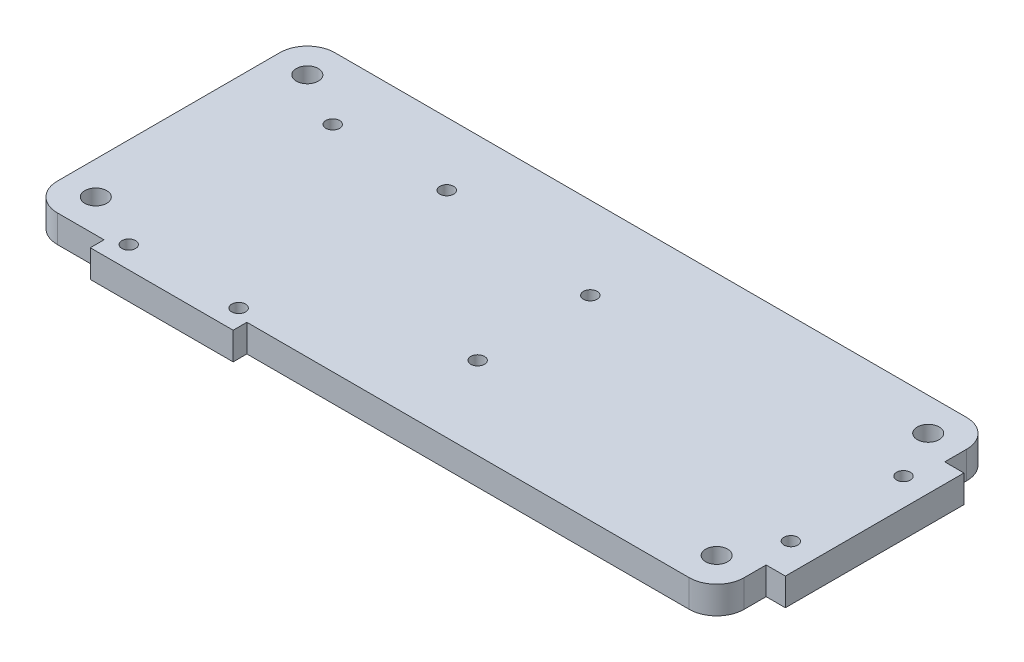
ISO-10303-21;
HEADER;
FILE_DESCRIPTION(('STEP AP214'),'2;1');
FILE_NAME('part.step','',(''),(''),'','','');
FILE_SCHEMA(('AUTOMOTIVE_DESIGN { 1 0 10303 214 1 1 1 1 }'));
ENDSEC;
DATA;
#1=APPLICATION_CONTEXT('core data for automotive mechanical design processes');
#2=APPLICATION_PROTOCOL_DEFINITION('international standard','automotive_design',2000,#1);
#3=PRODUCT_CONTEXT('',#1,'mechanical');
#4=PRODUCT('Part','Part','',(#3));
#5=PRODUCT_RELATED_PRODUCT_CATEGORY('part','',(#4));
#6=PRODUCT_DEFINITION_FORMATION('','',#4);
#7=PRODUCT_DEFINITION_CONTEXT('part definition',#1,'design');
#8=PRODUCT_DEFINITION('design','',#6,#7);
#9=PRODUCT_DEFINITION_SHAPE('','',#8);
#10=(LENGTH_UNIT() NAMED_UNIT(*) SI_UNIT(.MILLI.,.METRE.));
#11=(NAMED_UNIT(*) PLANE_ANGLE_UNIT() SI_UNIT($,.RADIAN.));
#12=(NAMED_UNIT(*) SI_UNIT($,.STERADIAN.) SOLID_ANGLE_UNIT());
#13=UNCERTAINTY_MEASURE_WITH_UNIT(LENGTH_MEASURE(1.E-05),#10,'distance_accuracy_value','');
#14=(GEOMETRIC_REPRESENTATION_CONTEXT(3) GLOBAL_UNCERTAINTY_ASSIGNED_CONTEXT((#13)) GLOBAL_UNIT_ASSIGNED_CONTEXT((#10,
#11,#12)) REPRESENTATION_CONTEXT('',''));
#15=CARTESIAN_POINT('',(0.,0.,0.));
#16=DIRECTION('',(0.,0.,1.));
#17=DIRECTION('',(1.,0.,0.));
#18=AXIS2_PLACEMENT_3D('',#15,#16,#17);
#19=CARTESIAN_POINT('',(0.,5.,0.));
#20=DIRECTION('',(0.,1.,0.));
#21=DIRECTION('',(0.,0.,1.));
#22=AXIS2_PLACEMENT_3D('',#19,#20,#21);
#23=PLANE('',#22);
#24=CARTESIAN_POINT('',(119.,5.,-44.5));
#25=DIRECTION('',(0.,1.,0.));
#26=DIRECTION('',(0.,0.,1.));
#27=AXIS2_PLACEMENT_3D('',#24,#25,#26);
#28=CIRCLE('',#27,2.);
#29=CARTESIAN_POINT('',(119.,5.,-42.5));
#30=VERTEX_POINT('',#29);
#31=EDGE_CURVE('E240',#30,#30,#28,.T.);
#32=ORIENTED_EDGE('',*,*,#31,.F.);
#33=EDGE_LOOP('',(#32));
#34=FACE_BOUND('',#33,.T.);
#35=CARTESIAN_POINT('',(6.,5.,-44.5));
#36=DIRECTION('',(0.,1.,0.));
#37=DIRECTION('',(0.,0.,1.));
#38=AXIS2_PLACEMENT_3D('',#35,#36,#37);
#39=CIRCLE('',#38,2.);
#40=CARTESIAN_POINT('',(6.,5.,-42.5));
#41=VERTEX_POINT('',#40);
#42=EDGE_CURVE('E244',#41,#41,#39,.T.);
#43=ORIENTED_EDGE('',*,*,#42,.F.);
#44=EDGE_LOOP('',(#43));
#45=FACE_BOUND('',#44,.T.);
#46=CARTESIAN_POINT('',(6.,5.,-6.));
#47=DIRECTION('',(0.,1.,0.));
#48=DIRECTION('',(0.,0.,1.));
#49=AXIS2_PLACEMENT_3D('',#46,#47,#48);
#50=CIRCLE('',#49,2.);
#51=CARTESIAN_POINT('',(6.,5.,-4.));
#52=VERTEX_POINT('',#51);
#53=EDGE_CURVE('E249',#52,#52,#50,.T.);
#54=ORIENTED_EDGE('',*,*,#53,.F.);
#55=EDGE_LOOP('',(#54));
#56=FACE_BOUND('',#55,.T.);
#57=CARTESIAN_POINT('',(119.,5.,-6.));
#58=DIRECTION('',(0.,1.,0.));
#59=DIRECTION('',(0.,0.,1.));
#60=AXIS2_PLACEMENT_3D('',#57,#58,#59);
#61=CIRCLE('',#60,2.);
#62=CARTESIAN_POINT('',(119.,5.,-4.));
#63=VERTEX_POINT('',#62);
#64=EDGE_CURVE('E253',#63,#63,#61,.T.);
#65=ORIENTED_EDGE('',*,*,#64,.F.);
#66=EDGE_LOOP('',(#65));
#67=FACE_BOUND('',#66,.T.);
#68=CARTESIAN_POINT('',(123.5,5.,-15.));
#69=DIRECTION('',(0.,1.,0.));
#70=DIRECTION('',(0.,0.,1.));
#71=AXIS2_PLACEMENT_3D('',#68,#69,#70);
#72=CIRCLE('',#71,1.25);
#73=CARTESIAN_POINT('',(123.5,5.,-13.75));
#74=VERTEX_POINT('',#73);
#75=EDGE_CURVE('E257',#74,#74,#72,.T.);
#76=ORIENTED_EDGE('',*,*,#75,.F.);
#77=EDGE_LOOP('',(#76));
#78=FACE_BOUND('',#77,.T.);
#79=CARTESIAN_POINT('',(66.5,5.,-15.));
#80=DIRECTION('',(0.,1.,0.));
#81=DIRECTION('',(0.,0.,1.));
#82=AXIS2_PLACEMENT_3D('',#79,#80,#81);
#83=CIRCLE('',#82,1.25);
#84=CARTESIAN_POINT('',(66.5,5.,-13.75));
#85=VERTEX_POINT('',#84);
#86=EDGE_CURVE('E261',#85,#85,#83,.T.);
#87=ORIENTED_EDGE('',*,*,#86,.F.);
#88=EDGE_LOOP('',(#87));
#89=FACE_BOUND('',#88,.T.);
#90=CARTESIAN_POINT('',(123.5,5.,-35.5));
#91=DIRECTION('',(0.,1.,0.));
#92=DIRECTION('',(0.,0.,1.));
#93=AXIS2_PLACEMENT_3D('',#90,#91,#92);
#94=CIRCLE('',#93,1.24999999999997);
#95=CARTESIAN_POINT('',(123.5,5.,-34.25));
#96=VERTEX_POINT('',#95);
#97=EDGE_CURVE('E265',#96,#96,#94,.T.);
#98=ORIENTED_EDGE('',*,*,#97,.F.);
#99=EDGE_LOOP('',(#98));
#100=FACE_BOUND('',#99,.T.);
#101=CARTESIAN_POINT('',(36.875,5.,-39.));
#102=DIRECTION('',(0.,1.,0.));
#103=DIRECTION('',(0.,0.,1.));
#104=AXIS2_PLACEMENT_3D('',#101,#102,#103);
#105=CIRCLE('',#104,1.25);
#106=CARTESIAN_POINT('',(36.875,5.,-37.75));
#107=VERTEX_POINT('',#106);
#108=EDGE_CURVE('E269',#107,#107,#105,.T.);
#109=ORIENTED_EDGE('',*,*,#108,.F.);
#110=EDGE_LOOP('',(#109));
#111=FACE_BOUND('',#110,.T.);
#112=CARTESIAN_POINT('',(36.5,5.,-1.5));
#113=DIRECTION('',(0.,1.,0.));
#114=DIRECTION('',(0.,0.,1.));
#115=AXIS2_PLACEMENT_3D('',#112,#113,#114);
#116=CIRCLE('',#115,1.25);
#117=CARTESIAN_POINT('',(36.5,5.,-0.250000000000002));
#118=VERTEX_POINT('',#117);
#119=EDGE_CURVE('E273',#118,#118,#116,.T.);
#120=ORIENTED_EDGE('',*,*,#119,.F.);
#121=EDGE_LOOP('',(#120));
#122=FACE_BOUND('',#121,.T.);
#123=CARTESIAN_POINT('',(16.5,5.,-1.5));
#124=DIRECTION('',(0.,1.,0.));
#125=DIRECTION('',(0.,0.,1.));
#126=AXIS2_PLACEMENT_3D('',#123,#124,#125);
#127=CIRCLE('',#126,1.25);
#128=CARTESIAN_POINT('',(16.5,5.,-0.249999999999999));
#129=VERTEX_POINT('',#128);
#130=EDGE_CURVE('E277',#129,#129,#127,.T.);
#131=ORIENTED_EDGE('',*,*,#130,.F.);
#132=EDGE_LOOP('',(#131));
#133=FACE_BOUND('',#132,.T.);
#134=CARTESIAN_POINT('',(16.125,5.,-39.));
#135=DIRECTION('',(0.,1.,0.));
#136=DIRECTION('',(0.,0.,1.));
#137=AXIS2_PLACEMENT_3D('',#134,#135,#136);
#138=CIRCLE('',#137,1.25);
#139=CARTESIAN_POINT('',(16.125,5.,-37.75));
#140=VERTEX_POINT('',#139);
#141=EDGE_CURVE('E299',#140,#140,#138,.T.);
#142=ORIENTED_EDGE('',*,*,#141,.F.);
#143=EDGE_LOOP('',(#142));
#144=FACE_BOUND('',#143,.T.);
#145=CARTESIAN_POINT('',(66.5,5.,-35.5));
#146=DIRECTION('',(0.,1.,0.));
#147=DIRECTION('',(0.,0.,1.));
#148=AXIS2_PLACEMENT_3D('',#145,#146,#147);
#149=CIRCLE('',#148,1.24999999999997);
#150=CARTESIAN_POINT('',(66.5,5.,-34.25));
#151=VERTEX_POINT('',#150);
#152=EDGE_CURVE('E303',#151,#151,#149,.T.);
#153=ORIENTED_EDGE('',*,*,#152,.F.);
#154=EDGE_LOOP('',(#153));
#155=FACE_BOUND('',#154,.T.);
#156=DIRECTION('',(0.,0.,1.));
#157=VECTOR('',#156,1.);
#158=CARTESIAN_POINT('',(13.5,5.,0.));
#159=LINE('',#158,#157);
#160=CARTESIAN_POINT('',(13.5,5.,0.));
#161=VERTEX_POINT('',#160);
#162=CARTESIAN_POINT('',(13.5,5.,2.5));
#163=VERTEX_POINT('',#162);
#164=EDGE_CURVE('E205',#161,#163,#159,.T.);
#165=ORIENTED_EDGE('',*,*,#164,.T.);
#166=DIRECTION('',(-1.,0.,0.));
#167=VECTOR('',#166,1.);
#168=CARTESIAN_POINT('',(13.5,5.,2.5));
#169=LINE('',#168,#167);
#170=CARTESIAN_POINT('',(39.5,5.,2.5));
#171=VERTEX_POINT('',#170);
#172=EDGE_CURVE('E202',#171,#163,#169,.T.);
#173=ORIENTED_EDGE('',*,*,#172,.F.);
#174=DIRECTION('',(0.,0.,-1.));
#175=VECTOR('',#174,1.);
#176=CARTESIAN_POINT('',(39.5,5.,0.));
#177=LINE('',#176,#175);
#178=CARTESIAN_POINT('',(39.5,5.,0.));
#179=VERTEX_POINT('',#178);
#180=EDGE_CURVE('E68',#171,#179,#177,.T.);
#181=ORIENTED_EDGE('',*,*,#180,.T.);
#182=DIRECTION('',(1.,0.,0.));
#183=VECTOR('',#182,1.);
#184=CARTESIAN_POINT('',(0.,5.,0.));
#185=LINE('',#184,#183);
#186=CARTESIAN_POINT('',(120.,5.,0.));
#187=VERTEX_POINT('',#186);
#188=EDGE_CURVE('E294',#179,#187,#185,.T.);
#189=ORIENTED_EDGE('',*,*,#188,.T.);
#190=CARTESIAN_POINT('',(120.,5.,-5.));
#191=DIRECTION('',(0.,1.,0.));
#192=DIRECTION('',(0.,0.,1.));
#193=AXIS2_PLACEMENT_3D('',#190,#191,#192);
#194=CIRCLE('',#193,5.);
#195=CARTESIAN_POINT('',(125.,5.,-5.));
#196=VERTEX_POINT('',#195);
#197=EDGE_CURVE('E384',#187,#196,#194,.T.);
#198=ORIENTED_EDGE('',*,*,#197,.T.);
#199=DIRECTION('',(0.,0.,-1.));
#200=VECTOR('',#199,1.);
#201=CARTESIAN_POINT('',(125.,5.,0.));
#202=LINE('',#201,#200);
#203=CARTESIAN_POINT('',(125.,5.,-9.));
#204=VERTEX_POINT('',#203);
#205=EDGE_CURVE('E282',#196,#204,#202,.T.);
#206=ORIENTED_EDGE('',*,*,#205,.T.);
#207=DIRECTION('',(1.,0.,0.));
#208=VECTOR('',#207,1.);
#209=CARTESIAN_POINT('',(125.,5.,-9.));
#210=LINE('',#209,#208);
#211=CARTESIAN_POINT('',(128.5,5.,-9.));
#212=VERTEX_POINT('',#211);
#213=EDGE_CURVE('E222',#204,#212,#210,.T.);
#214=ORIENTED_EDGE('',*,*,#213,.T.);
#215=DIRECTION('',(0.,0.,1.));
#216=VECTOR('',#215,1.);
#217=CARTESIAN_POINT('',(128.5,5.,-9.));
#218=LINE('',#217,#216);
#219=CARTESIAN_POINT('',(128.5,5.,-41.5));
#220=VERTEX_POINT('',#219);
#221=EDGE_CURVE('E186',#220,#212,#218,.T.);
#222=ORIENTED_EDGE('',*,*,#221,.F.);
#223=DIRECTION('',(-1.,0.,0.));
#224=VECTOR('',#223,1.);
#225=CARTESIAN_POINT('',(128.,5.,-41.5));
#226=LINE('',#225,#224);
#227=CARTESIAN_POINT('',(125.,5.,-41.5));
#228=VERTEX_POINT('',#227);
#229=EDGE_CURVE('E171',#220,#228,#226,.T.);
#230=ORIENTED_EDGE('',*,*,#229,.T.);
#231=CARTESIAN_POINT('',(125.,5.,-45.5));
#232=VERTEX_POINT('',#231);
#233=EDGE_CURVE('E281',#228,#232,#202,.T.);
#234=ORIENTED_EDGE('',*,*,#233,.T.);
#235=CARTESIAN_POINT('',(120.,5.,-45.5));
#236=DIRECTION('',(0.,1.,0.));
#237=DIRECTION('',(0.,0.,1.));
#238=AXIS2_PLACEMENT_3D('',#235,#236,#237);
#239=CIRCLE('',#238,5.);
#240=CARTESIAN_POINT('',(120.,5.,-50.5));
#241=VERTEX_POINT('',#240);
#242=EDGE_CURVE('E387',#232,#241,#239,.T.);
#243=ORIENTED_EDGE('',*,*,#242,.T.);
#244=DIRECTION('',(1.,0.,0.));
#245=VECTOR('',#244,1.);
#246=CARTESIAN_POINT('',(0.,5.,-50.5));
#247=LINE('',#246,#245);
#248=CARTESIAN_POINT('',(5.,5.,-50.5));
#249=VERTEX_POINT('',#248);
#250=EDGE_CURVE('E286',#249,#241,#247,.T.);
#251=ORIENTED_EDGE('',*,*,#250,.F.);
#252=CARTESIAN_POINT('',(5.,5.,-45.5));
#253=DIRECTION('',(0.,1.,0.));
#254=DIRECTION('',(0.,0.,1.));
#255=AXIS2_PLACEMENT_3D('',#252,#253,#254);
#256=CIRCLE('',#255,5.);
#257=CARTESIAN_POINT('',(0.,5.,-45.5));
#258=VERTEX_POINT('',#257);
#259=EDGE_CURVE('E390',#249,#258,#256,.T.);
#260=ORIENTED_EDGE('',*,*,#259,.T.);
#261=DIRECTION('',(0.,0.,-1.));
#262=VECTOR('',#261,1.);
#263=CARTESIAN_POINT('',(0.,5.,0.));
#264=LINE('',#263,#262);
#265=CARTESIAN_POINT('',(0.,5.,-5.));
#266=VERTEX_POINT('',#265);
#267=EDGE_CURVE('E290',#266,#258,#264,.T.);
#268=ORIENTED_EDGE('',*,*,#267,.F.);
#269=CARTESIAN_POINT('',(5.,5.,-5.));
#270=DIRECTION('',(0.,1.,0.));
#271=DIRECTION('',(0.,0.,1.));
#272=AXIS2_PLACEMENT_3D('',#269,#270,#271);
#273=CIRCLE('',#272,5.);
#274=CARTESIAN_POINT('',(5.,5.,0.));
#275=VERTEX_POINT('',#274);
#276=EDGE_CURVE('E381',#266,#275,#273,.T.);
#277=ORIENTED_EDGE('',*,*,#276,.T.);
#278=EDGE_CURVE('E295',#275,#161,#185,.T.);
#279=ORIENTED_EDGE('',*,*,#278,.T.);
#280=EDGE_LOOP('',(#165,#173,#181,#189,#198,#206,#214,#222,#230,#234,#243,#251,#260,#268,#277,#279));
#281=FACE_BOUND('',#280,.T.);
#282=ADVANCED_FACE('F43',(#34,#45,#56,#67,#78,#89,#100,#111,#122,#133,#144,#155,#281),#23,.T.);
#283=CARTESIAN_POINT('',(0.,0.,0.));
#284=DIRECTION('',(0.,1.,0.));
#285=DIRECTION('',(0.,0.,1.));
#286=AXIS2_PLACEMENT_3D('',#283,#284,#285);
#287=PLANE('',#286);
#288=CARTESIAN_POINT('',(66.5,0.,-35.5));
#289=DIRECTION('',(0.,1.,0.));
#290=DIRECTION('',(0.,0.,1.));
#291=AXIS2_PLACEMENT_3D('',#288,#289,#290);
#292=CIRCLE('',#291,1.24999999999997);
#293=CARTESIAN_POINT('',(66.5,0.,-34.25));
#294=VERTEX_POINT('',#293);
#295=EDGE_CURVE('E245',#294,#294,#292,.T.);
#296=ORIENTED_EDGE('',*,*,#295,.T.);
#297=EDGE_LOOP('',(#296));
#298=FACE_BOUND('',#297,.T.);
#299=CARTESIAN_POINT('',(16.125,0.,-39.));
#300=DIRECTION('',(0.,1.,0.));
#301=DIRECTION('',(0.,0.,1.));
#302=AXIS2_PLACEMENT_3D('',#299,#300,#301);
#303=CIRCLE('',#302,1.25);
#304=CARTESIAN_POINT('',(16.125,0.,-37.75));
#305=VERTEX_POINT('',#304);
#306=EDGE_CURVE('E347',#305,#305,#303,.T.);
#307=ORIENTED_EDGE('',*,*,#306,.T.);
#308=EDGE_LOOP('',(#307));
#309=FACE_BOUND('',#308,.T.);
#310=CARTESIAN_POINT('',(16.5,0.,-1.5));
#311=DIRECTION('',(0.,1.,0.));
#312=DIRECTION('',(0.,0.,1.));
#313=AXIS2_PLACEMENT_3D('',#310,#311,#312);
#314=CIRCLE('',#313,1.25);
#315=CARTESIAN_POINT('',(16.5,0.,-0.249999999999999));
#316=VERTEX_POINT('',#315);
#317=EDGE_CURVE('E327',#316,#316,#314,.T.);
#318=ORIENTED_EDGE('',*,*,#317,.T.);
#319=EDGE_LOOP('',(#318));
#320=FACE_BOUND('',#319,.T.);
#321=CARTESIAN_POINT('',(36.5,0.,-1.5));
#322=DIRECTION('',(0.,1.,0.));
#323=DIRECTION('',(0.,0.,1.));
#324=AXIS2_PLACEMENT_3D('',#321,#322,#323);
#325=CIRCLE('',#324,1.25);
#326=CARTESIAN_POINT('',(36.5,0.,-0.250000000000002));
#327=VERTEX_POINT('',#326);
#328=EDGE_CURVE('E323',#327,#327,#325,.T.);
#329=ORIENTED_EDGE('',*,*,#328,.T.);
#330=EDGE_LOOP('',(#329));
#331=FACE_BOUND('',#330,.T.);
#332=CARTESIAN_POINT('',(36.875,0.,-39.));
#333=DIRECTION('',(0.,1.,0.));
#334=DIRECTION('',(0.,0.,1.));
#335=AXIS2_PLACEMENT_3D('',#332,#333,#334);
#336=CIRCLE('',#335,1.25);
#337=CARTESIAN_POINT('',(36.875,0.,-37.75));
#338=VERTEX_POINT('',#337);
#339=EDGE_CURVE('E319',#338,#338,#336,.T.);
#340=ORIENTED_EDGE('',*,*,#339,.T.);
#341=EDGE_LOOP('',(#340));
#342=FACE_BOUND('',#341,.T.);
#343=CARTESIAN_POINT('',(123.5,0.,-35.5));
#344=DIRECTION('',(0.,1.,0.));
#345=DIRECTION('',(0.,0.,1.));
#346=AXIS2_PLACEMENT_3D('',#343,#344,#345);
#347=CIRCLE('',#346,1.24999999999997);
#348=CARTESIAN_POINT('',(123.5,0.,-34.25));
#349=VERTEX_POINT('',#348);
#350=EDGE_CURVE('E315',#349,#349,#347,.T.);
#351=ORIENTED_EDGE('',*,*,#350,.T.);
#352=EDGE_LOOP('',(#351));
#353=FACE_BOUND('',#352,.T.);
#354=CARTESIAN_POINT('',(66.5,0.,-15.));
#355=DIRECTION('',(0.,1.,0.));
#356=DIRECTION('',(0.,0.,1.));
#357=AXIS2_PLACEMENT_3D('',#354,#355,#356);
#358=CIRCLE('',#357,1.25);
#359=CARTESIAN_POINT('',(66.5,0.,-13.75));
#360=VERTEX_POINT('',#359);
#361=EDGE_CURVE('E311',#360,#360,#358,.T.);
#362=ORIENTED_EDGE('',*,*,#361,.T.);
#363=EDGE_LOOP('',(#362));
#364=FACE_BOUND('',#363,.T.);
#365=CARTESIAN_POINT('',(123.5,0.,-15.));
#366=DIRECTION('',(0.,1.,0.));
#367=DIRECTION('',(0.,0.,1.));
#368=AXIS2_PLACEMENT_3D('',#365,#366,#367);
#369=CIRCLE('',#368,1.25);
#370=CARTESIAN_POINT('',(123.5,0.,-13.75));
#371=VERTEX_POINT('',#370);
#372=EDGE_CURVE('E237',#371,#371,#369,.T.);
#373=ORIENTED_EDGE('',*,*,#372,.T.);
#374=EDGE_LOOP('',(#373));
#375=FACE_BOUND('',#374,.T.);
#376=CARTESIAN_POINT('',(6.,0.,-6.));
#377=DIRECTION('',(0.,1.,0.));
#378=DIRECTION('',(0.,0.,1.));
#379=AXIS2_PLACEMENT_3D('',#376,#377,#378);
#380=CIRCLE('',#379,3.5);
#381=CARTESIAN_POINT('',(6.,0.,-2.5));
#382=VERTEX_POINT('',#381);
#383=EDGE_CURVE('E409',#382,#382,#380,.T.);
#384=ORIENTED_EDGE('',*,*,#383,.T.);
#385=EDGE_LOOP('',(#384));
#386=FACE_BOUND('',#385,.T.);
#387=CARTESIAN_POINT('',(6.,0.,-44.5));
#388=DIRECTION('',(0.,1.,0.));
#389=DIRECTION('',(0.,0.,1.));
#390=AXIS2_PLACEMENT_3D('',#387,#388,#389);
#391=CIRCLE('',#390,3.50000000000002);
#392=CARTESIAN_POINT('',(6.,0.,-41.));
#393=VERTEX_POINT('',#392);
#394=EDGE_CURVE('E413',#393,#393,#391,.T.);
#395=ORIENTED_EDGE('',*,*,#394,.T.);
#396=EDGE_LOOP('',(#395));
#397=FACE_BOUND('',#396,.T.);
#398=CARTESIAN_POINT('',(119.,0.,-44.5));
#399=DIRECTION('',(0.,1.,0.));
#400=DIRECTION('',(0.,0.,1.));
#401=AXIS2_PLACEMENT_3D('',#398,#399,#400);
#402=CIRCLE('',#401,3.50000000000002);
#403=CARTESIAN_POINT('',(119.,0.,-48.));
#404=VERTEX_POINT('',#403);
#405=EDGE_CURVE('E417',#404,#404,#402,.T.);
#406=ORIENTED_EDGE('',*,*,#405,.T.);
#407=EDGE_LOOP('',(#406));
#408=FACE_BOUND('',#407,.T.);
#409=CARTESIAN_POINT('',(119.,0.,-6.));
#410=DIRECTION('',(0.,1.,0.));
#411=DIRECTION('',(0.,0.,1.));
#412=AXIS2_PLACEMENT_3D('',#409,#410,#411);
#413=CIRCLE('',#412,3.5);
#414=CARTESIAN_POINT('',(119.,0.,-2.5));
#415=VERTEX_POINT('',#414);
#416=EDGE_CURVE('E421',#415,#415,#413,.T.);
#417=ORIENTED_EDGE('',*,*,#416,.T.);
#418=EDGE_LOOP('',(#417));
#419=FACE_BOUND('',#418,.T.);
#420=DIRECTION('',(1.,0.,0.));
#421=VECTOR('',#420,1.);
#422=CARTESIAN_POINT('',(13.5,0.,2.5));
#423=LINE('',#422,#421);
#424=CARTESIAN_POINT('',(13.5,0.,2.5));
#425=VERTEX_POINT('',#424);
#426=CARTESIAN_POINT('',(39.5,0.,2.5));
#427=VERTEX_POINT('',#426);
#428=EDGE_CURVE('E60',#425,#427,#423,.T.);
#429=ORIENTED_EDGE('',*,*,#428,.F.);
#430=DIRECTION('',(0.,0.,1.));
#431=VECTOR('',#430,1.);
#432=CARTESIAN_POINT('',(13.5,0.,0.));
#433=LINE('',#432,#431);
#434=CARTESIAN_POINT('',(13.5,0.,0.));
#435=VERTEX_POINT('',#434);
#436=EDGE_CURVE('E206',#435,#425,#433,.T.);
#437=ORIENTED_EDGE('',*,*,#436,.F.);
#438=DIRECTION('',(1.,0.,0.));
#439=VECTOR('',#438,1.);
#440=CARTESIAN_POINT('',(0.,0.,0.));
#441=LINE('',#440,#439);
#442=CARTESIAN_POINT('',(5.,0.,0.));
#443=VERTEX_POINT('',#442);
#444=EDGE_CURVE('E344',#443,#435,#441,.T.);
#445=ORIENTED_EDGE('',*,*,#444,.F.);
#446=CARTESIAN_POINT('',(5.,0.,-5.));
#447=DIRECTION('',(0.,1.,0.));
#448=DIRECTION('',(0.,0.,1.));
#449=AXIS2_PLACEMENT_3D('',#446,#447,#448);
#450=CIRCLE('',#449,5.);
#451=CARTESIAN_POINT('',(0.,0.,-5.));
#452=VERTEX_POINT('',#451);
#453=EDGE_CURVE('E360',#443,#452,#450,.F.);
#454=ORIENTED_EDGE('',*,*,#453,.T.);
#455=DIRECTION('',(0.,0.,-1.));
#456=VECTOR('',#455,1.);
#457=CARTESIAN_POINT('',(0.,0.,0.));
#458=LINE('',#457,#456);
#459=CARTESIAN_POINT('',(0.,0.,-45.5));
#460=VERTEX_POINT('',#459);
#461=EDGE_CURVE('E339',#452,#460,#458,.T.);
#462=ORIENTED_EDGE('',*,*,#461,.T.);
#463=CARTESIAN_POINT('',(5.,0.,-45.5));
#464=DIRECTION('',(0.,1.,0.));
#465=DIRECTION('',(0.,0.,1.));
#466=AXIS2_PLACEMENT_3D('',#463,#464,#465);
#467=CIRCLE('',#466,5.);
#468=CARTESIAN_POINT('',(5.,0.,-50.5));
#469=VERTEX_POINT('',#468);
#470=EDGE_CURVE('E371',#460,#469,#467,.F.);
#471=ORIENTED_EDGE('',*,*,#470,.T.);
#472=DIRECTION('',(1.,0.,0.));
#473=VECTOR('',#472,1.);
#474=CARTESIAN_POINT('',(0.,0.,-50.5));
#475=LINE('',#474,#473);
#476=CARTESIAN_POINT('',(120.,0.,-50.5));
#477=VERTEX_POINT('',#476);
#478=EDGE_CURVE('E335',#469,#477,#475,.T.);
#479=ORIENTED_EDGE('',*,*,#478,.T.);
#480=CARTESIAN_POINT('',(120.,0.,-45.5));
#481=DIRECTION('',(0.,1.,0.));
#482=DIRECTION('',(0.,0.,1.));
#483=AXIS2_PLACEMENT_3D('',#480,#481,#482);
#484=CIRCLE('',#483,5.);
#485=CARTESIAN_POINT('',(125.,0.,-45.5));
#486=VERTEX_POINT('',#485);
#487=EDGE_CURVE('E367',#477,#486,#484,.F.);
#488=ORIENTED_EDGE('',*,*,#487,.T.);
#489=DIRECTION('',(0.,0.,-1.));
#490=VECTOR('',#489,1.);
#491=CARTESIAN_POINT('',(125.,0.,0.));
#492=LINE('',#491,#490);
#493=CARTESIAN_POINT('',(125.,0.,-41.5));
#494=VERTEX_POINT('',#493);
#495=EDGE_CURVE('E331',#494,#486,#492,.T.);
#496=ORIENTED_EDGE('',*,*,#495,.F.);
#497=DIRECTION('',(-1.,0.,0.));
#498=VECTOR('',#497,1.);
#499=CARTESIAN_POINT('',(128.,0.,-41.5));
#500=LINE('',#499,#498);
#501=CARTESIAN_POINT('',(128.5,0.,-41.5));
#502=VERTEX_POINT('',#501);
#503=EDGE_CURVE('E170',#502,#494,#500,.T.);
#504=ORIENTED_EDGE('',*,*,#503,.F.);
#505=DIRECTION('',(0.,0.,-1.));
#506=VECTOR('',#505,1.);
#507=CARTESIAN_POINT('',(128.5,0.,-9.));
#508=LINE('',#507,#506);
#509=CARTESIAN_POINT('',(128.5,0.,-9.));
#510=VERTEX_POINT('',#509);
#511=EDGE_CURVE('E174',#510,#502,#508,.T.);
#512=ORIENTED_EDGE('',*,*,#511,.F.);
#513=DIRECTION('',(1.,0.,0.));
#514=VECTOR('',#513,1.);
#515=CARTESIAN_POINT('',(125.,0.,-9.));
#516=LINE('',#515,#514);
#517=CARTESIAN_POINT('',(125.,0.,-9.));
#518=VERTEX_POINT('',#517);
#519=EDGE_CURVE('E160',#518,#510,#516,.T.);
#520=ORIENTED_EDGE('',*,*,#519,.F.);
#521=CARTESIAN_POINT('',(125.,0.,-5.));
#522=VERTEX_POINT('',#521);
#523=EDGE_CURVE('E332',#522,#518,#492,.T.);
#524=ORIENTED_EDGE('',*,*,#523,.F.);
#525=CARTESIAN_POINT('',(120.,0.,-5.));
#526=DIRECTION('',(0.,1.,0.));
#527=DIRECTION('',(0.,0.,1.));
#528=AXIS2_PLACEMENT_3D('',#525,#526,#527);
#529=CIRCLE('',#528,5.);
#530=CARTESIAN_POINT('',(120.,0.,0.));
#531=VERTEX_POINT('',#530);
#532=EDGE_CURVE('E363',#522,#531,#529,.F.);
#533=ORIENTED_EDGE('',*,*,#532,.T.);
#534=CARTESIAN_POINT('',(39.5,0.,0.));
#535=VERTEX_POINT('',#534);
#536=EDGE_CURVE('E343',#535,#531,#441,.T.);
#537=ORIENTED_EDGE('',*,*,#536,.F.);
#538=DIRECTION('',(0.,0.,-1.));
#539=VECTOR('',#538,1.);
#540=CARTESIAN_POINT('',(39.5,0.,0.));
#541=LINE('',#540,#539);
#542=EDGE_CURVE('E210',#427,#535,#541,.T.);
#543=ORIENTED_EDGE('',*,*,#542,.F.);
#544=EDGE_LOOP('',(#429,#437,#445,#454,#462,#471,#479,#488,#496,#504,#512,#520,#524,#533,#537,#543));
#545=FACE_BOUND('',#544,.T.);
#546=ADVANCED_FACE('F175',(#298,#309,#320,#331,#342,#353,#364,#375,#386,#397,#408,#419,#545),
#287,.F.);
#547=CARTESIAN_POINT('',(13.5,0.,0.));
#548=DIRECTION('',(-1.,0.,0.));
#549=DIRECTION('',(0.,0.,1.));
#550=AXIS2_PLACEMENT_3D('',#547,#548,#549);
#551=PLANE('',#550);
#552=ORIENTED_EDGE('',*,*,#436,.T.);
#553=DIRECTION('',(0.,-1.,0.));
#554=VECTOR('',#553,1.);
#555=CARTESIAN_POINT('',(13.5,5.,2.5));
#556=LINE('',#555,#554);
#557=EDGE_CURVE('E194',#163,#425,#556,.T.);
#558=ORIENTED_EDGE('',*,*,#557,.F.);
#559=ORIENTED_EDGE('',*,*,#164,.F.);
#560=DIRECTION('',(0.,1.,0.));
#561=VECTOR('',#560,1.);
#562=CARTESIAN_POINT('',(13.5,0.,0.));
#563=LINE('',#562,#561);
#564=EDGE_CURVE('E219',#435,#161,#563,.T.);
#565=ORIENTED_EDGE('',*,*,#564,.F.);
#566=EDGE_LOOP('',(#552,#558,#559,#565));
#567=FACE_BOUND('',#566,.T.);
#568=ADVANCED_FACE('F447',(#567),#551,.T.);
#569=CARTESIAN_POINT('',(39.5,0.,0.));
#570=DIRECTION('',(1.,0.,0.));
#571=DIRECTION('',(0.,0.,-1.));
#572=AXIS2_PLACEMENT_3D('',#569,#570,#571);
#573=PLANE('',#572);
#574=ORIENTED_EDGE('',*,*,#180,.F.);
#575=DIRECTION('',(0.,1.,0.));
#576=VECTOR('',#575,1.);
#577=CARTESIAN_POINT('',(39.5,5.,2.5));
#578=LINE('',#577,#576);
#579=EDGE_CURVE('E199',#427,#171,#578,.T.);
#580=ORIENTED_EDGE('',*,*,#579,.F.);
#581=ORIENTED_EDGE('',*,*,#542,.T.);
#582=DIRECTION('',(0.,1.,0.));
#583=VECTOR('',#582,1.);
#584=CARTESIAN_POINT('',(39.5,0.,0.));
#585=LINE('',#584,#583);
#586=EDGE_CURVE('E213',#535,#179,#585,.T.);
#587=ORIENTED_EDGE('',*,*,#586,.T.);
#588=EDGE_LOOP('',(#574,#580,#581,#587));
#589=FACE_BOUND('',#588,.T.);
#590=ADVANCED_FACE('F565',(#589),#573,.T.);
#591=CARTESIAN_POINT('',(0.,5.,0.));
#592=DIRECTION('',(0.,0.,-1.));
#593=DIRECTION('',(-1.,0.,0.));
#594=AXIS2_PLACEMENT_3D('',#591,#592,#593);
#595=PLANE('',#594);
#596=ORIENTED_EDGE('',*,*,#444,.T.);
#597=ORIENTED_EDGE('',*,*,#564,.T.);
#598=ORIENTED_EDGE('',*,*,#278,.F.);
#599=DIRECTION('',(0.,-1.,0.));
#600=VECTOR('',#599,1.);
#601=CARTESIAN_POINT('',(5.,0.,0.));
#602=LINE('',#601,#600);
#603=EDGE_CURVE('E401',#275,#443,#602,.T.);
#604=ORIENTED_EDGE('',*,*,#603,.T.);
#605=EDGE_LOOP('',(#596,#597,#598,#604));
#606=FACE_BOUND('',#605,.T.);
#607=ADVANCED_FACE('F496',(#606),#595,.F.);
#608=CARTESIAN_POINT('',(125.,5.,0.));
#609=DIRECTION('',(-1.,0.,0.));
#610=DIRECTION('',(0.,0.,1.));
#611=AXIS2_PLACEMENT_3D('',#608,#609,#610);
#612=PLANE('',#611);
#613=ORIENTED_EDGE('',*,*,#233,.F.);
#614=DIRECTION('',(0.,1.,0.));
#615=VECTOR('',#614,1.);
#616=CARTESIAN_POINT('',(125.,0.,-41.5));
#617=LINE('',#616,#615);
#618=EDGE_CURVE('E233',#494,#228,#617,.T.);
#619=ORIENTED_EDGE('',*,*,#618,.F.);
#620=ORIENTED_EDGE('',*,*,#495,.T.);
#621=DIRECTION('',(0.,-1.,0.));
#622=VECTOR('',#621,1.);
#623=CARTESIAN_POINT('',(125.,5.,-45.5));
#624=LINE('',#623,#622);
#625=EDGE_CURVE('E397',#486,#232,#624,.F.);
#626=ORIENTED_EDGE('',*,*,#625,.T.);
#627=EDGE_LOOP('',(#613,#619,#620,#626));
#628=FACE_BOUND('',#627,.T.);
#629=ADVANCED_FACE('F507',(#628),#612,.F.);
#630=ORIENTED_EDGE('',*,*,#523,.T.);
#631=DIRECTION('',(0.,1.,0.));
#632=VECTOR('',#631,1.);
#633=CARTESIAN_POINT('',(125.,0.,-9.));
#634=LINE('',#633,#632);
#635=EDGE_CURVE('E166',#518,#204,#634,.T.);
#636=ORIENTED_EDGE('',*,*,#635,.T.);
#637=ORIENTED_EDGE('',*,*,#205,.F.);
#638=DIRECTION('',(0.,-1.,0.));
#639=VECTOR('',#638,1.);
#640=CARTESIAN_POINT('',(125.,5.,-5.));
#641=LINE('',#640,#639);
#642=EDGE_CURVE('E393',#196,#522,#641,.T.);
#643=ORIENTED_EDGE('',*,*,#642,.T.);
#644=EDGE_LOOP('',(#630,#636,#637,#643));
#645=FACE_BOUND('',#644,.T.);
#646=ADVANCED_FACE('F503',(#645),#612,.F.);
#647=CARTESIAN_POINT('',(0.,5.,-50.5));
#648=DIRECTION('',(0.,0.,-1.));
#649=DIRECTION('',(-1.,0.,0.));
#650=AXIS2_PLACEMENT_3D('',#647,#648,#649);
#651=PLANE('',#650);
#652=ORIENTED_EDGE('',*,*,#478,.F.);
#653=DIRECTION('',(0.,-1.,0.));
#654=VECTOR('',#653,1.);
#655=CARTESIAN_POINT('',(5.,5.,-50.5));
#656=LINE('',#655,#654);
#657=EDGE_CURVE('E378',#469,#249,#656,.F.);
#658=ORIENTED_EDGE('',*,*,#657,.T.);
#659=ORIENTED_EDGE('',*,*,#250,.T.);
#660=DIRECTION('',(0.,-1.,0.));
#661=VECTOR('',#660,1.);
#662=CARTESIAN_POINT('',(120.,0.,-50.5));
#663=LINE('',#662,#661);
#664=EDGE_CURVE('E374',#241,#477,#663,.T.);
#665=ORIENTED_EDGE('',*,*,#664,.T.);
#666=EDGE_LOOP('',(#652,#658,#659,#665));
#667=FACE_BOUND('',#666,.T.);
#668=ADVANCED_FACE('F499',(#667),#651,.T.);
#669=CARTESIAN_POINT('',(0.,5.,0.));
#670=DIRECTION('',(-1.,0.,0.));
#671=DIRECTION('',(0.,0.,1.));
#672=AXIS2_PLACEMENT_3D('',#669,#670,#671);
#673=PLANE('',#672);
#674=ORIENTED_EDGE('',*,*,#267,.T.);
#675=DIRECTION('',(0.,-1.,0.));
#676=VECTOR('',#675,1.);
#677=CARTESIAN_POINT('',(0.,5.,-45.5));
#678=LINE('',#677,#676);
#679=EDGE_CURVE('E356',#258,#460,#678,.T.);
#680=ORIENTED_EDGE('',*,*,#679,.T.);
#681=ORIENTED_EDGE('',*,*,#461,.F.);
#682=DIRECTION('',(0.,-1.,0.));
#683=VECTOR('',#682,1.);
#684=CARTESIAN_POINT('',(0.,5.,-5.));
#685=LINE('',#684,#683);
#686=EDGE_CURVE('E307',#452,#266,#685,.F.);
#687=ORIENTED_EDGE('',*,*,#686,.T.);
#688=EDGE_LOOP('',(#674,#680,#681,#687));
#689=FACE_BOUND('',#688,.T.);
#690=ADVANCED_FACE('F490',(#689),#673,.T.);
#691=CARTESIAN_POINT('',(16.125,5.,-39.));
#692=DIRECTION('',(0.,-1.,0.));
#693=DIRECTION('',(0.,0.,-1.));
#694=AXIS2_PLACEMENT_3D('',#691,#692,#693);
#695=CYLINDRICAL_SURFACE('',#694,1.25);
#696=ORIENTED_EDGE('',*,*,#141,.T.);
#697=EDGE_LOOP('',(#696));
#698=FACE_BOUND('',#697,.T.);
#699=ORIENTED_EDGE('',*,*,#306,.F.);
#700=EDGE_LOOP('',(#699));
#701=FACE_BOUND('',#700,.T.);
#702=ADVANCED_FACE('F486',(#698,#701),#695,.F.);
#703=ORIENTED_EDGE('',*,*,#188,.F.);
#704=ORIENTED_EDGE('',*,*,#586,.F.);
#705=ORIENTED_EDGE('',*,*,#536,.T.);
#706=DIRECTION('',(0.,-1.,0.));
#707=VECTOR('',#706,1.);
#708=CARTESIAN_POINT('',(120.,5.,0.));
#709=LINE('',#708,#707);
#710=EDGE_CURVE('E405',#531,#187,#709,.F.);
#711=ORIENTED_EDGE('',*,*,#710,.T.);
#712=EDGE_LOOP('',(#703,#704,#705,#711));
#713=FACE_BOUND('',#712,.T.);
#714=ADVANCED_FACE('F489',(#713),#595,.F.);
#715=CARTESIAN_POINT('',(16.5,5.,-1.5));
#716=DIRECTION('',(0.,-1.,0.));
#717=DIRECTION('',(0.,0.,-1.));
#718=AXIS2_PLACEMENT_3D('',#715,#716,#717);
#719=CYLINDRICAL_SURFACE('',#718,1.25);
#720=ORIENTED_EDGE('',*,*,#130,.T.);
#721=EDGE_LOOP('',(#720));
#722=FACE_BOUND('',#721,.T.);
#723=ORIENTED_EDGE('',*,*,#317,.F.);
#724=EDGE_LOOP('',(#723));
#725=FACE_BOUND('',#724,.T.);
#726=ADVANCED_FACE('F494',(#722,#725),#719,.F.);
#727=CARTESIAN_POINT('',(36.5,5.,-1.5));
#728=DIRECTION('',(0.,-1.,0.));
#729=DIRECTION('',(0.,0.,-1.));
#730=AXIS2_PLACEMENT_3D('',#727,#728,#729);
#731=CYLINDRICAL_SURFACE('',#730,1.25);
#732=ORIENTED_EDGE('',*,*,#119,.T.);
#733=EDGE_LOOP('',(#732));
#734=FACE_BOUND('',#733,.T.);
#735=ORIENTED_EDGE('',*,*,#328,.F.);
#736=EDGE_LOOP('',(#735));
#737=FACE_BOUND('',#736,.T.);
#738=ADVANCED_FACE('F511',(#734,#737),#731,.F.);
#739=CARTESIAN_POINT('',(36.875,5.,-39.));
#740=DIRECTION('',(0.,-1.,0.));
#741=DIRECTION('',(0.,0.,-1.));
#742=AXIS2_PLACEMENT_3D('',#739,#740,#741);
#743=CYLINDRICAL_SURFACE('',#742,1.25);
#744=ORIENTED_EDGE('',*,*,#108,.T.);
#745=EDGE_LOOP('',(#744));
#746=FACE_BOUND('',#745,.T.);
#747=ORIENTED_EDGE('',*,*,#339,.F.);
#748=EDGE_LOOP('',(#747));
#749=FACE_BOUND('',#748,.T.);
#750=ADVANCED_FACE('F515',(#746,#749),#743,.F.);
#751=CARTESIAN_POINT('',(123.5,5.,-35.5));
#752=DIRECTION('',(0.,-1.,0.));
#753=DIRECTION('',(0.,0.,-1.));
#754=AXIS2_PLACEMENT_3D('',#751,#752,#753);
#755=CYLINDRICAL_SURFACE('',#754,1.24999999999997);
#756=ORIENTED_EDGE('',*,*,#97,.T.);
#757=EDGE_LOOP('',(#756));
#758=FACE_BOUND('',#757,.T.);
#759=ORIENTED_EDGE('',*,*,#350,.F.);
#760=EDGE_LOOP('',(#759));
#761=FACE_BOUND('',#760,.T.);
#762=ADVANCED_FACE('F519',(#758,#761),#755,.F.);
#763=CARTESIAN_POINT('',(66.5,5.,-15.));
#764=DIRECTION('',(0.,-1.,0.));
#765=DIRECTION('',(0.,0.,-1.));
#766=AXIS2_PLACEMENT_3D('',#763,#764,#765);
#767=CYLINDRICAL_SURFACE('',#766,1.25);
#768=ORIENTED_EDGE('',*,*,#86,.T.);
#769=EDGE_LOOP('',(#768));
#770=FACE_BOUND('',#769,.T.);
#771=ORIENTED_EDGE('',*,*,#361,.F.);
#772=EDGE_LOOP('',(#771));
#773=FACE_BOUND('',#772,.T.);
#774=ADVANCED_FACE('F523',(#770,#773),#767,.F.);
#775=CARTESIAN_POINT('',(123.5,5.,-15.));
#776=DIRECTION('',(0.,-1.,0.));
#777=DIRECTION('',(0.,0.,-1.));
#778=AXIS2_PLACEMENT_3D('',#775,#776,#777);
#779=CYLINDRICAL_SURFACE('',#778,1.25);
#780=ORIENTED_EDGE('',*,*,#75,.T.);
#781=EDGE_LOOP('',(#780));
#782=FACE_BOUND('',#781,.T.);
#783=ORIENTED_EDGE('',*,*,#372,.F.);
#784=EDGE_LOOP('',(#783));
#785=FACE_BOUND('',#784,.T.);
#786=ADVANCED_FACE('F527',(#782,#785),#779,.F.);
#787=CARTESIAN_POINT('',(119.,5.,-6.));
#788=DIRECTION('',(0.,-1.,0.));
#789=DIRECTION('',(0.,0.,-1.));
#790=AXIS2_PLACEMENT_3D('',#787,#788,#789);
#791=CYLINDRICAL_SURFACE('',#790,2.);
#792=CARTESIAN_POINT('',(119.,1.50000000000001,-6.));
#793=DIRECTION('',(0.,1.,0.));
#794=DIRECTION('',(0.,0.,1.));
#795=AXIS2_PLACEMENT_3D('',#792,#793,#794);
#796=CIRCLE('',#795,2.);
#797=CARTESIAN_POINT('',(119.,1.50000000000001,-4.));
#798=VERTEX_POINT('',#797);
#799=EDGE_CURVE('E425',#798,#798,#796,.F.);
#800=ORIENTED_EDGE('',*,*,#799,.T.);
#801=EDGE_LOOP('',(#800));
#802=FACE_BOUND('',#801,.T.);
#803=ORIENTED_EDGE('',*,*,#64,.T.);
#804=EDGE_LOOP('',(#803));
#805=FACE_BOUND('',#804,.T.);
#806=ADVANCED_FACE('F531',(#802,#805),#791,.F.);
#807=CARTESIAN_POINT('',(6.,5.,-6.));
#808=DIRECTION('',(0.,-1.,0.));
#809=DIRECTION('',(0.,0.,-1.));
#810=AXIS2_PLACEMENT_3D('',#807,#808,#809);
#811=CYLINDRICAL_SURFACE('',#810,2.);
#812=CARTESIAN_POINT('',(6.,1.50000000000001,-6.));
#813=DIRECTION('',(0.,1.,0.));
#814=DIRECTION('',(0.,0.,1.));
#815=AXIS2_PLACEMENT_3D('',#812,#813,#814);
#816=CIRCLE('',#815,2.);
#817=CARTESIAN_POINT('',(6.,1.50000000000001,-4.));
#818=VERTEX_POINT('',#817);
#819=EDGE_CURVE('E11',#818,#818,#816,.F.);
#820=ORIENTED_EDGE('',*,*,#819,.T.);
#821=EDGE_LOOP('',(#820));
#822=FACE_BOUND('',#821,.T.);
#823=ORIENTED_EDGE('',*,*,#53,.T.);
#824=EDGE_LOOP('',(#823));
#825=FACE_BOUND('',#824,.T.);
#826=ADVANCED_FACE('F535',(#822,#825),#811,.F.);
#827=CARTESIAN_POINT('',(6.,5.,-44.5));
#828=DIRECTION('',(0.,-1.,0.));
#829=DIRECTION('',(0.,0.,-1.));
#830=AXIS2_PLACEMENT_3D('',#827,#828,#829);
#831=CYLINDRICAL_SURFACE('',#830,2.);
#832=CARTESIAN_POINT('',(6.,1.50000000000002,-44.5));
#833=DIRECTION('',(0.,1.,0.));
#834=DIRECTION('',(0.,0.,1.));
#835=AXIS2_PLACEMENT_3D('',#832,#833,#834);
#836=CIRCLE('',#835,2.);
#837=CARTESIAN_POINT('',(6.,1.50000000000002,-42.5));
#838=VERTEX_POINT('',#837);
#839=EDGE_CURVE('E53',#838,#838,#836,.F.);
#840=ORIENTED_EDGE('',*,*,#839,.T.);
#841=EDGE_LOOP('',(#840));
#842=FACE_BOUND('',#841,.T.);
#843=ORIENTED_EDGE('',*,*,#42,.T.);
#844=EDGE_LOOP('',(#843));
#845=FACE_BOUND('',#844,.T.);
#846=ADVANCED_FACE('F436',(#842,#845),#831,.F.);
#847=CARTESIAN_POINT('',(119.,5.,-44.5));
#848=DIRECTION('',(0.,-1.,0.));
#849=DIRECTION('',(0.,0.,-1.));
#850=AXIS2_PLACEMENT_3D('',#847,#848,#849);
#851=CYLINDRICAL_SURFACE('',#850,2.);
#852=CARTESIAN_POINT('',(119.,1.50000000000002,-44.5));
#853=DIRECTION('',(0.,1.,0.));
#854=DIRECTION('',(0.,0.,1.));
#855=AXIS2_PLACEMENT_3D('',#852,#853,#854);
#856=CIRCLE('',#855,2.);
#857=CARTESIAN_POINT('',(119.,1.50000000000002,-46.5));
#858=VERTEX_POINT('',#857);
#859=EDGE_CURVE('E429',#858,#858,#856,.F.);
#860=ORIENTED_EDGE('',*,*,#859,.T.);
#861=EDGE_LOOP('',(#860));
#862=FACE_BOUND('',#861,.T.);
#863=ORIENTED_EDGE('',*,*,#31,.T.);
#864=EDGE_LOOP('',(#863));
#865=FACE_BOUND('',#864,.T.);
#866=ADVANCED_FACE('F484',(#862,#865),#851,.F.);
#867=CARTESIAN_POINT('',(66.5,5.,-35.5));
#868=DIRECTION('',(0.,-1.,0.));
#869=DIRECTION('',(0.,0.,-1.));
#870=AXIS2_PLACEMENT_3D('',#867,#868,#869);
#871=CYLINDRICAL_SURFACE('',#870,1.24999999999997);
#872=ORIENTED_EDGE('',*,*,#152,.T.);
#873=EDGE_LOOP('',(#872));
#874=FACE_BOUND('',#873,.T.);
#875=ORIENTED_EDGE('',*,*,#295,.F.);
#876=EDGE_LOOP('',(#875));
#877=FACE_BOUND('',#876,.T.);
#878=ADVANCED_FACE('F480',(#874,#877),#871,.F.);
#879=CARTESIAN_POINT('',(5.,5.,-45.5));
#880=DIRECTION('',(0.,-1.,0.));
#881=DIRECTION('',(0.,0.,-1.));
#882=AXIS2_PLACEMENT_3D('',#879,#880,#881);
#883=CYLINDRICAL_SURFACE('',#882,5.);
#884=ORIENTED_EDGE('',*,*,#259,.F.);
#885=ORIENTED_EDGE('',*,*,#657,.F.);
#886=ORIENTED_EDGE('',*,*,#470,.F.);
#887=ORIENTED_EDGE('',*,*,#679,.F.);
#888=EDGE_LOOP('',(#884,#885,#886,#887));
#889=FACE_BOUND('',#888,.T.);
#890=ADVANCED_FACE('F483',(#889),#883,.T.);
#891=CARTESIAN_POINT('',(120.,5.,-45.5));
#892=DIRECTION('',(0.,1.,0.));
#893=DIRECTION('',(0.,0.,1.));
#894=AXIS2_PLACEMENT_3D('',#891,#892,#893);
#895=CYLINDRICAL_SURFACE('',#894,5.);
#896=ORIENTED_EDGE('',*,*,#242,.F.);
#897=ORIENTED_EDGE('',*,*,#625,.F.);
#898=ORIENTED_EDGE('',*,*,#487,.F.);
#899=ORIENTED_EDGE('',*,*,#664,.F.);
#900=EDGE_LOOP('',(#896,#897,#898,#899));
#901=FACE_BOUND('',#900,.T.);
#902=ADVANCED_FACE('F547',(#901),#895,.T.);
#903=CARTESIAN_POINT('',(120.,5.,-5.));
#904=DIRECTION('',(0.,-1.,0.));
#905=DIRECTION('',(0.,0.,-1.));
#906=AXIS2_PLACEMENT_3D('',#903,#904,#905);
#907=CYLINDRICAL_SURFACE('',#906,5.);
#908=ORIENTED_EDGE('',*,*,#197,.F.);
#909=ORIENTED_EDGE('',*,*,#710,.F.);
#910=ORIENTED_EDGE('',*,*,#532,.F.);
#911=ORIENTED_EDGE('',*,*,#642,.F.);
#912=EDGE_LOOP('',(#908,#909,#910,#911));
#913=FACE_BOUND('',#912,.T.);
#914=ADVANCED_FACE('F465',(#913),#907,.T.);
#915=CARTESIAN_POINT('',(5.,5.,-5.));
#916=DIRECTION('',(0.,1.,0.));
#917=DIRECTION('',(0.,0.,1.));
#918=AXIS2_PLACEMENT_3D('',#915,#916,#917);
#919=CYLINDRICAL_SURFACE('',#918,5.);
#920=ORIENTED_EDGE('',*,*,#276,.F.);
#921=ORIENTED_EDGE('',*,*,#686,.F.);
#922=ORIENTED_EDGE('',*,*,#453,.F.);
#923=ORIENTED_EDGE('',*,*,#603,.F.);
#924=EDGE_LOOP('',(#920,#921,#922,#923));
#925=FACE_BOUND('',#924,.T.);
#926=ADVANCED_FACE('F456',(#925),#919,.T.);
#927=CARTESIAN_POINT('',(119.,0.,-6.));
#928=DIRECTION('',(0.,-1.,0.));
#929=DIRECTION('',(0.,0.,-1.));
#930=AXIS2_PLACEMENT_3D('',#927,#928,#929);
#931=CONICAL_SURFACE('',#930,3.5,0.785398163397446);
#932=ORIENTED_EDGE('',*,*,#799,.F.);
#933=EDGE_LOOP('',(#932));
#934=FACE_BOUND('',#933,.T.);
#935=ORIENTED_EDGE('',*,*,#416,.F.);
#936=EDGE_LOOP('',(#935));
#937=FACE_BOUND('',#936,.T.);
#938=ADVANCED_FACE('F454',(#934,#937),#931,.F.);
#939=CARTESIAN_POINT('',(119.,0.,-44.5));
#940=DIRECTION('',(0.,-1.,0.));
#941=DIRECTION('',(0.,0.,-1.));
#942=AXIS2_PLACEMENT_3D('',#939,#940,#941);
#943=CONICAL_SURFACE('',#942,3.50000000000002,0.785398163397447);
#944=CARTESIAN_POINT('',(119.,1.50000000000002,-46.5));
#945=CARTESIAN_POINT('',(119.,1.48437500000002,-46.515625));
#946=CARTESIAN_POINT('',(119.,1.46875000000002,-46.53125));
#947=CARTESIAN_POINT('',(119.,1.43750000000002,-46.5625));
#948=CARTESIAN_POINT('',(119.,1.42187500000002,-46.578125));
#949=CARTESIAN_POINT('',(119.,1.39062500000002,-46.609375));
#950=CARTESIAN_POINT('',(119.,1.37500000000002,-46.625));
#951=CARTESIAN_POINT('',(119.,1.34375000000002,-46.65625));
#952=CARTESIAN_POINT('',(119.,1.32812500000002,-46.671875));
#953=CARTESIAN_POINT('',(119.,1.29687500000002,-46.703125));
#954=CARTESIAN_POINT('',(119.,1.28125000000002,-46.71875));
#955=CARTESIAN_POINT('',(119.,1.25000000000002,-46.75));
#956=CARTESIAN_POINT('',(119.,1.23437500000002,-46.765625));
#957=CARTESIAN_POINT('',(119.,1.20312500000002,-46.796875));
#958=CARTESIAN_POINT('',(119.,1.18750000000002,-46.8125));
#959=CARTESIAN_POINT('',(119.,1.15625000000002,-46.84375));
#960=CARTESIAN_POINT('',(119.,1.14062500000002,-46.859375));
#961=CARTESIAN_POINT('',(119.,1.10937500000002,-46.890625));
#962=CARTESIAN_POINT('',(119.,1.09375000000002,-46.90625));
#963=CARTESIAN_POINT('',(119.,1.06250000000002,-46.9375));
#964=CARTESIAN_POINT('',(119.,1.04687500000002,-46.953125));
#965=CARTESIAN_POINT('',(119.,1.01562500000002,-46.984375));
#966=CARTESIAN_POINT('',(119.,1.00000000000001,-47.));
#967=CARTESIAN_POINT('',(119.,0.968750000000014,-47.03125));
#968=CARTESIAN_POINT('',(119.,0.953125000000015,-47.046875));
#969=CARTESIAN_POINT('',(119.,0.921875000000015,-47.078125));
#970=CARTESIAN_POINT('',(119.,0.906250000000014,-47.09375));
#971=CARTESIAN_POINT('',(119.,0.875000000000014,-47.125));
#972=CARTESIAN_POINT('',(119.,0.859375000000013,-47.140625));
#973=CARTESIAN_POINT('',(119.,0.828125000000013,-47.171875));
#974=CARTESIAN_POINT('',(119.,0.812500000000012,-47.1875));
#975=CARTESIAN_POINT('',(119.,0.781250000000012,-47.21875));
#976=CARTESIAN_POINT('',(119.,0.765625000000013,-47.234375));
#977=CARTESIAN_POINT('',(119.,0.734375000000012,-47.265625));
#978=CARTESIAN_POINT('',(119.,0.718750000000011,-47.28125));
#979=CARTESIAN_POINT('',(119.,0.68750000000001,-47.3125));
#980=CARTESIAN_POINT('',(119.,0.67187500000001,-47.328125));
#981=CARTESIAN_POINT('',(119.,0.64062500000001,-47.359375));
#982=CARTESIAN_POINT('',(119.,0.62500000000001,-47.375));
#983=CARTESIAN_POINT('',(119.,0.593750000000009,-47.40625));
#984=CARTESIAN_POINT('',(119.,0.578125000000009,-47.421875));
#985=CARTESIAN_POINT('',(119.,0.546875000000008,-47.453125));
#986=CARTESIAN_POINT('',(119.,0.531250000000008,-47.46875));
#987=CARTESIAN_POINT('',(119.,0.500000000000008,-47.5));
#988=CARTESIAN_POINT('',(119.,0.484375000000008,-47.515625));
#989=CARTESIAN_POINT('',(119.,0.453125000000007,-47.546875));
#990=CARTESIAN_POINT('',(119.,0.437500000000006,-47.5625));
#991=CARTESIAN_POINT('',(119.,0.406250000000006,-47.59375));
#992=CARTESIAN_POINT('',(119.,0.390625000000006,-47.609375));
#993=CARTESIAN_POINT('',(119.,0.359375000000006,-47.640625));
#994=CARTESIAN_POINT('',(119.,0.343750000000005,-47.65625));
#995=CARTESIAN_POINT('',(119.,0.312500000000005,-47.6875));
#996=CARTESIAN_POINT('',(119.,0.296875000000005,-47.703125));
#997=CARTESIAN_POINT('',(119.,0.265625000000004,-47.734375));
#998=CARTESIAN_POINT('',(119.,0.250000000000004,-47.75));
#999=CARTESIAN_POINT('',(119.,0.218750000000004,-47.78125));
#1000=CARTESIAN_POINT('',(119.,0.203125000000004,-47.796875));
#1001=CARTESIAN_POINT('',(119.,0.171875000000003,-47.828125));
#1002=CARTESIAN_POINT('',(119.,0.156250000000002,-47.84375));
#1003=CARTESIAN_POINT('',(119.,0.125000000000001,-47.875));
#1004=CARTESIAN_POINT('',(119.,0.109375000000001,-47.890625));
#1005=CARTESIAN_POINT('',(119.,0.0781250000000013,-47.921875));
#1006=CARTESIAN_POINT('',(119.,0.062500000000001,-47.9375));
#1007=CARTESIAN_POINT('',(119.,0.0312500000000004,-47.96875));
#1008=CARTESIAN_POINT('',(119.,0.015625,-47.984375));
#1009=CARTESIAN_POINT('',(119.,0.,-48.));
#1010=B_SPLINE_CURVE_WITH_KNOTS('',3,(#944,#945,#946,#947,#948,#949,#950,#951,#952,#953,#954,
#955,#956,#957,#958,#959,#960,#961,#962,#963,#964,#965,#966,#967,#968,#969,#970,#971,#972,#973,
#974,#975,#976,#977,#978,#979,#980,#981,#982,#983,#984,#985,#986,#987,#988,#989,#990,#991,#992,
#993,#994,#995,#996,#997,#998,#999,#1000,#1001,#1002,#1003,#1004,#1005,#1006,#1007,#1008,#1009),
.UNSPECIFIED.,.F.,.F.,(4,2,2,2,2,2,2,2,2,2,2,2,2,2,2,2,2,2,2,2,2,2,2,2,2,2,2,2,2,2,2,2,4),(0.,
0.0662912607362406,0.132582521472481,0.198873782208722,0.265165042944962,0.331456303681198,
0.397747564417439,0.464038825153679,0.53033008588992,0.596621346626161,0.662912607362401,
0.729203868098637,0.795495128834877,0.861786389571118,0.928077650307358,0.994368911043599,
1.06066017177984,1.12695143251608,1.19324269325232,1.25953395398856,1.3258252147248,
1.39211647546104,1.45840773619728,1.52469899693351,1.59099025766975,1.657281518406,
1.72357277914224,1.78986403987848,1.85615530061472,1.92244656135095,1.98873782208719,
2.05502908282343,2.12132034355967),.UNSPECIFIED.);
#1011=EDGE_CURVE('BSEAM442',#858,#404,#1010,.T.);
#1012=ORIENTED_EDGE('',*,*,#859,.F.);
#1013=ORIENTED_EDGE('',*,*,#405,.F.);
#1014=ORIENTED_EDGE('',*,*,#1011,.T.);
#1015=ORIENTED_EDGE('',*,*,#1011,.F.);
#1016=EDGE_LOOP('',(#1012,#1014,#1013,#1015));
#1017=FACE_BOUND('',#1016,.T.);
#1018=ADVANCED_FACE('F442',(#1017),#943,.F.);
#1019=CARTESIAN_POINT('',(6.,0.,-44.5));
#1020=DIRECTION('',(0.,-1.,0.));
#1021=DIRECTION('',(0.,0.,-1.));
#1022=AXIS2_PLACEMENT_3D('',#1019,#1020,#1021);
#1023=CONICAL_SURFACE('',#1022,3.50000000000002,0.785398163397447);
#1024=ORIENTED_EDGE('',*,*,#839,.F.);
#1025=EDGE_LOOP('',(#1024));
#1026=FACE_BOUND('',#1025,.T.);
#1027=ORIENTED_EDGE('',*,*,#394,.F.);
#1028=EDGE_LOOP('',(#1027));
#1029=FACE_BOUND('',#1028,.T.);
#1030=ADVANCED_FACE('F439',(#1026,#1029),#1023,.F.);
#1031=CARTESIAN_POINT('',(6.,0.,-6.));
#1032=DIRECTION('',(0.,-1.,0.));
#1033=DIRECTION('',(0.,0.,-1.));
#1034=AXIS2_PLACEMENT_3D('',#1031,#1032,#1033);
#1035=CONICAL_SURFACE('',#1034,3.5,0.785398163397446);
#1036=ORIENTED_EDGE('',*,*,#819,.F.);
#1037=EDGE_LOOP('',(#1036));
#1038=FACE_BOUND('',#1037,.T.);
#1039=ORIENTED_EDGE('',*,*,#383,.F.);
#1040=EDGE_LOOP('',(#1039));
#1041=FACE_BOUND('',#1040,.T.);
#1042=ADVANCED_FACE('F46',(#1038,#1041),#1035,.F.);
#1043=CARTESIAN_POINT('',(128.,0.,-41.5));
#1044=DIRECTION('',(0.,0.,-1.));
#1045=DIRECTION('',(-1.,0.,0.));
#1046=AXIS2_PLACEMENT_3D('',#1043,#1044,#1045);
#1047=PLANE('',#1046);
#1048=ORIENTED_EDGE('',*,*,#229,.F.);
#1049=DIRECTION('',(0.,1.,0.));
#1050=VECTOR('',#1049,1.);
#1051=CARTESIAN_POINT('',(128.5,5.,-41.5));
#1052=LINE('',#1051,#1050);
#1053=EDGE_CURVE('E181',#502,#220,#1052,.T.);
#1054=ORIENTED_EDGE('',*,*,#1053,.F.);
#1055=ORIENTED_EDGE('',*,*,#503,.T.);
#1056=ORIENTED_EDGE('',*,*,#618,.T.);
#1057=EDGE_LOOP('',(#1048,#1054,#1055,#1056));
#1058=FACE_BOUND('',#1057,.T.);
#1059=ADVANCED_FACE('F592',(#1058),#1047,.T.);
#1060=CARTESIAN_POINT('',(125.,0.,-9.));
#1061=DIRECTION('',(0.,0.,1.));
#1062=DIRECTION('',(1.,0.,0.));
#1063=AXIS2_PLACEMENT_3D('',#1060,#1061,#1062);
#1064=PLANE('',#1063);
#1065=ORIENTED_EDGE('',*,*,#213,.F.);
#1066=ORIENTED_EDGE('',*,*,#635,.F.);
#1067=ORIENTED_EDGE('',*,*,#519,.T.);
#1068=DIRECTION('',(0.,-1.,0.));
#1069=VECTOR('',#1068,1.);
#1070=CARTESIAN_POINT('',(128.5,5.,-9.));
#1071=LINE('',#1070,#1069);
#1072=EDGE_CURVE('E165',#212,#510,#1071,.T.);
#1073=ORIENTED_EDGE('',*,*,#1072,.F.);
#1074=EDGE_LOOP('',(#1065,#1066,#1067,#1073));
#1075=FACE_BOUND('',#1074,.T.);
#1076=ADVANCED_FACE('F163',(#1075),#1064,.T.);
#1077=CARTESIAN_POINT('',(0.,0.,2.5));
#1078=DIRECTION('',(0.,0.,1.));
#1079=DIRECTION('',(1.,0.,0.));
#1080=AXIS2_PLACEMENT_3D('',#1077,#1078,#1079);
#1081=PLANE('',#1080);
#1082=ORIENTED_EDGE('',*,*,#557,.T.);
#1083=ORIENTED_EDGE('',*,*,#428,.T.);
#1084=ORIENTED_EDGE('',*,*,#579,.T.);
#1085=ORIENTED_EDGE('',*,*,#172,.T.);
#1086=EDGE_LOOP('',(#1082,#1083,#1084,#1085));
#1087=FACE_BOUND('',#1086,.T.);
#1088=ADVANCED_FACE('F566',(#1087),#1081,.T.);
#1089=CARTESIAN_POINT('',(128.5,0.,0.));
#1090=DIRECTION('',(1.,0.,0.));
#1091=DIRECTION('',(0.,0.,-1.));
#1092=AXIS2_PLACEMENT_3D('',#1089,#1090,#1091);
#1093=PLANE('',#1092);
#1094=ORIENTED_EDGE('',*,*,#1072,.T.);
#1095=ORIENTED_EDGE('',*,*,#511,.T.);
#1096=ORIENTED_EDGE('',*,*,#1053,.T.);
#1097=ORIENTED_EDGE('',*,*,#221,.T.);
#1098=EDGE_LOOP('',(#1094,#1095,#1096,#1097));
#1099=FACE_BOUND('',#1098,.T.);
#1100=ADVANCED_FACE('F184',(#1099),#1093,.T.);
#1101=CLOSED_SHELL('',(#282,#546,#568,#590,#607,#629,#646,#668,#690,#702,#714,#726,#738,#750,
#762,#774,#786,#806,#826,#846,#866,#878,#890,#902,#914,#926,#938,#1018,#1030,#1042,#1059,#1076,
#1088,#1100));
#1102=MANIFOLD_SOLID_BREP('B2',#1101);
#1103=ADVANCED_BREP_SHAPE_REPRESENTATION('',(#18,#1102),#14);
#1104=SHAPE_DEFINITION_REPRESENTATION(#9,#1103);
ENDSEC;
END-ISO-10303-21;
